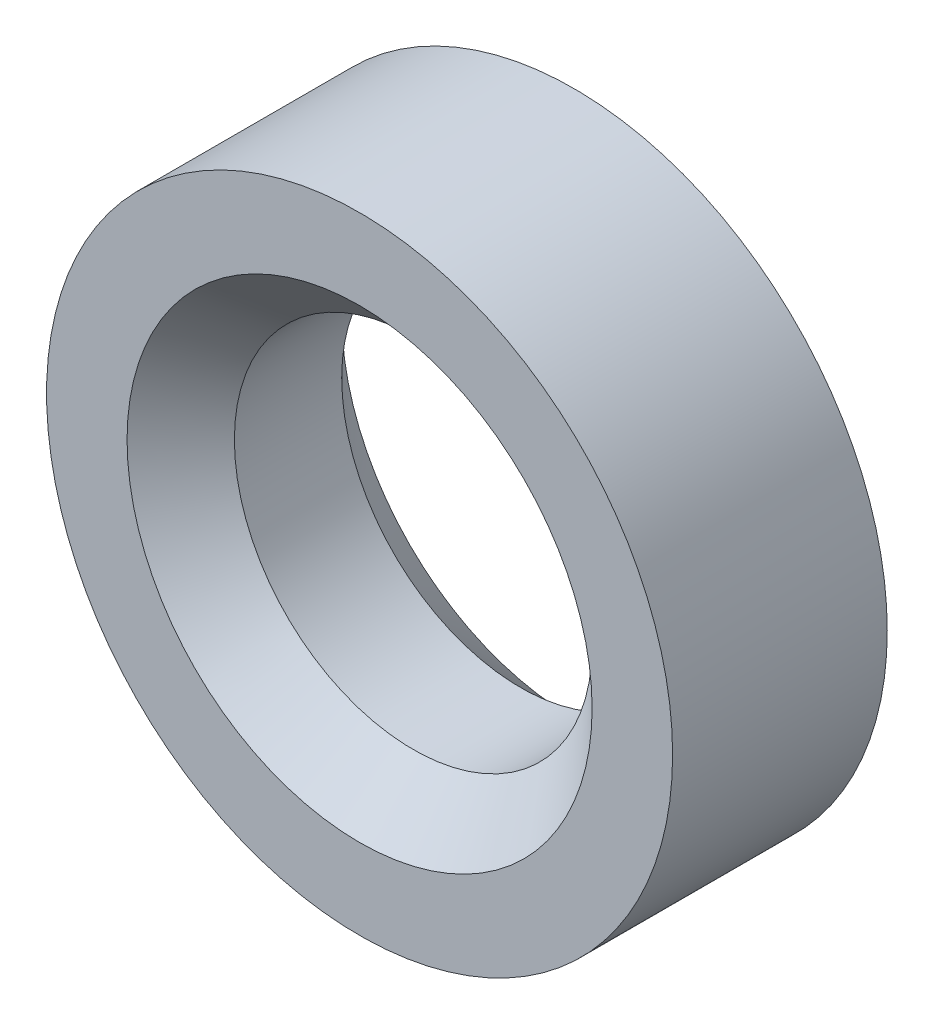
ISO-10303-21;
HEADER;
FILE_DESCRIPTION(('STEP AP214'),'2;1');
FILE_NAME('part.step','',(''),(''),'','','');
FILE_SCHEMA(('AUTOMOTIVE_DESIGN { 1 0 10303 214 1 1 1 1 }'));
ENDSEC;
DATA;
#1=APPLICATION_CONTEXT('core data for automotive mechanical design processes');
#2=APPLICATION_PROTOCOL_DEFINITION('international standard','automotive_design',2000,#1);
#3=PRODUCT_CONTEXT('',#1,'mechanical');
#4=PRODUCT('Part','Part','',(#3));
#5=PRODUCT_RELATED_PRODUCT_CATEGORY('part','',(#4));
#6=PRODUCT_DEFINITION_FORMATION('','',#4);
#7=PRODUCT_DEFINITION_CONTEXT('part definition',#1,'design');
#8=PRODUCT_DEFINITION('design','',#6,#7);
#9=PRODUCT_DEFINITION_SHAPE('','',#8);
#10=(LENGTH_UNIT() NAMED_UNIT(*) SI_UNIT(.MILLI.,.METRE.));
#11=(NAMED_UNIT(*) PLANE_ANGLE_UNIT() SI_UNIT($,.RADIAN.));
#12=(NAMED_UNIT(*) SI_UNIT($,.STERADIAN.) SOLID_ANGLE_UNIT());
#13=UNCERTAINTY_MEASURE_WITH_UNIT(LENGTH_MEASURE(1.E-05),#10,'distance_accuracy_value','');
#14=(GEOMETRIC_REPRESENTATION_CONTEXT(3) GLOBAL_UNCERTAINTY_ASSIGNED_CONTEXT((#13)) GLOBAL_UNIT_ASSIGNED_CONTEXT((#10,
#11,#12)) REPRESENTATION_CONTEXT('',''));
#15=CARTESIAN_POINT('',(0.,0.,0.));
#16=DIRECTION('',(0.,0.,1.));
#17=DIRECTION('',(1.,0.,0.));
#18=AXIS2_PLACEMENT_3D('',#15,#16,#17);
#19=CARTESIAN_POINT('',(0.,0.,1.2));
#20=DIRECTION('',(0.,0.,1.));
#21=DIRECTION('',(1.,0.,0.));
#22=AXIS2_PLACEMENT_3D('',#19,#20,#21);
#23=PLANE('',#22);
#24=CARTESIAN_POINT('',(0.,0.,1.2));
#25=DIRECTION('',(0.,0.,1.));
#26=DIRECTION('',(1.,0.,0.));
#27=AXIS2_PLACEMENT_3D('',#24,#25,#26);
#28=CIRCLE('',#27,2.6);
#29=CARTESIAN_POINT('',(2.6,0.,1.2));
#30=VERTEX_POINT('',#29);
#31=EDGE_CURVE('E10',#30,#30,#28,.F.);
#32=ORIENTED_EDGE('',*,*,#31,.T.);
#33=EDGE_LOOP('',(#32));
#34=FACE_BOUND('',#33,.T.);
#35=CARTESIAN_POINT('',(0.,0.,1.2));
#36=DIRECTION('',(0.,0.,1.));
#37=DIRECTION('',(1.,0.,0.));
#38=AXIS2_PLACEMENT_3D('',#35,#36,#37);
#39=CIRCLE('',#38,3.5);
#40=CARTESIAN_POINT('',(3.5,0.,1.2));
#41=VERTEX_POINT('',#40);
#42=EDGE_CURVE('E70',#41,#41,#39,.T.);
#43=ORIENTED_EDGE('',*,*,#42,.T.);
#44=EDGE_LOOP('',(#43));
#45=FACE_BOUND('',#44,.T.);
#46=ADVANCED_FACE('F45',(#34,#45),#23,.T.);
#47=CARTESIAN_POINT('',(0.,0.,-1.2));
#48=DIRECTION('',(0.,0.,1.));
#49=DIRECTION('',(1.,0.,0.));
#50=AXIS2_PLACEMENT_3D('',#47,#48,#49);
#51=PLANE('',#50);
#52=CARTESIAN_POINT('',(0.,0.,-1.2));
#53=DIRECTION('',(0.,0.,1.));
#54=DIRECTION('',(1.,0.,0.));
#55=AXIS2_PLACEMENT_3D('',#52,#53,#54);
#56=CIRCLE('',#55,2.6);
#57=CARTESIAN_POINT('',(2.6,0.,-1.2));
#58=VERTEX_POINT('',#57);
#59=EDGE_CURVE('E64',#58,#58,#56,.T.);
#60=ORIENTED_EDGE('',*,*,#59,.T.);
#61=EDGE_LOOP('',(#60));
#62=FACE_BOUND('',#61,.T.);
#63=CARTESIAN_POINT('',(0.,0.,-1.2));
#64=DIRECTION('',(0.,0.,1.));
#65=DIRECTION('',(1.,0.,0.));
#66=AXIS2_PLACEMENT_3D('',#63,#64,#65);
#67=CIRCLE('',#66,3.5);
#68=CARTESIAN_POINT('',(3.5,0.,-1.2));
#69=VERTEX_POINT('',#68);
#70=EDGE_CURVE('E71',#69,#69,#67,.T.);
#71=ORIENTED_EDGE('',*,*,#70,.F.);
#72=EDGE_LOOP('',(#71));
#73=FACE_BOUND('',#72,.T.);
#74=ADVANCED_FACE('F84',(#62,#73),#51,.F.);
#75=CARTESIAN_POINT('',(0.,0.,1.2));
#76=DIRECTION('',(0.,0.,-1.));
#77=DIRECTION('',(-1.,0.,0.));
#78=AXIS2_PLACEMENT_3D('',#75,#76,#77);
#79=CYLINDRICAL_SURFACE('',#78,3.5);
#80=ORIENTED_EDGE('',*,*,#42,.F.);
#81=EDGE_LOOP('',(#80));
#82=FACE_BOUND('',#81,.T.);
#83=ORIENTED_EDGE('',*,*,#70,.T.);
#84=EDGE_LOOP('',(#83));
#85=FACE_BOUND('',#84,.T.);
#86=ADVANCED_FACE('F80',(#82,#85),#79,.T.);
#87=CARTESIAN_POINT('',(0.,0.,1.2));
#88=DIRECTION('',(0.,0.,-1.));
#89=DIRECTION('',(-1.,0.,0.));
#90=AXIS2_PLACEMENT_3D('',#87,#88,#89);
#91=CYLINDRICAL_SURFACE('',#90,2.);
#92=CARTESIAN_POINT('',(0.,0.,-0.599999999999997));
#93=DIRECTION('',(0.,0.,1.));
#94=DIRECTION('',(1.,0.,0.));
#95=AXIS2_PLACEMENT_3D('',#92,#93,#94);
#96=CIRCLE('',#95,2.);
#97=CARTESIAN_POINT('',(2.,0.,-0.599999999999997));
#98=VERTEX_POINT('',#97);
#99=EDGE_CURVE('E54',#98,#98,#96,.F.);
#100=ORIENTED_EDGE('',*,*,#99,.T.);
#101=EDGE_LOOP('',(#100));
#102=FACE_BOUND('',#101,.T.);
#103=CARTESIAN_POINT('',(0.,0.,0.600000000000001));
#104=DIRECTION('',(0.,0.,1.));
#105=DIRECTION('',(1.,0.,0.));
#106=AXIS2_PLACEMENT_3D('',#103,#104,#105);
#107=CIRCLE('',#106,2.);
#108=CARTESIAN_POINT('',(2.,0.,0.600000000000001));
#109=VERTEX_POINT('',#108);
#110=EDGE_CURVE('E59',#109,#109,#107,.T.);
#111=ORIENTED_EDGE('',*,*,#110,.T.);
#112=EDGE_LOOP('',(#111));
#113=FACE_BOUND('',#112,.T.);
#114=ADVANCED_FACE('F83',(#102,#113),#91,.F.);
#115=CARTESIAN_POINT('',(0.,0.,-1.2));
#116=DIRECTION('',(0.,0.,-1.));
#117=DIRECTION('',(-1.,0.,0.));
#118=AXIS2_PLACEMENT_3D('',#115,#116,#117);
#119=CONICAL_SURFACE('',#118,2.6,0.785398163397446);
#120=ORIENTED_EDGE('',*,*,#99,.F.);
#121=EDGE_LOOP('',(#120));
#122=FACE_BOUND('',#121,.T.);
#123=ORIENTED_EDGE('',*,*,#59,.F.);
#124=EDGE_LOOP('',(#123));
#125=FACE_BOUND('',#124,.T.);
#126=ADVANCED_FACE('F98',(#122,#125),#119,.F.);
#127=CARTESIAN_POINT('',(0.,0.,0.600000000000001));
#128=DIRECTION('',(0.,0.,1.));
#129=DIRECTION('',(1.,0.,0.));
#130=AXIS2_PLACEMENT_3D('',#127,#128,#129);
#131=CONICAL_SURFACE('',#130,2.,0.78539816339745);
#132=ORIENTED_EDGE('',*,*,#31,.F.);
#133=EDGE_LOOP('',(#132));
#134=FACE_BOUND('',#133,.T.);
#135=ORIENTED_EDGE('',*,*,#110,.F.);
#136=EDGE_LOOP('',(#135));
#137=FACE_BOUND('',#136,.T.);
#138=ADVANCED_FACE('F48',(#134,#137),#131,.F.);
#139=CLOSED_SHELL('',(#46,#74,#86,#114,#126,#138));
#140=MANIFOLD_SOLID_BREP('B2',#139);
#141=ADVANCED_BREP_SHAPE_REPRESENTATION('',(#18,#140),#14);
#142=SHAPE_DEFINITION_REPRESENTATION(#9,#141);
ENDSEC;
END-ISO-10303-21;
